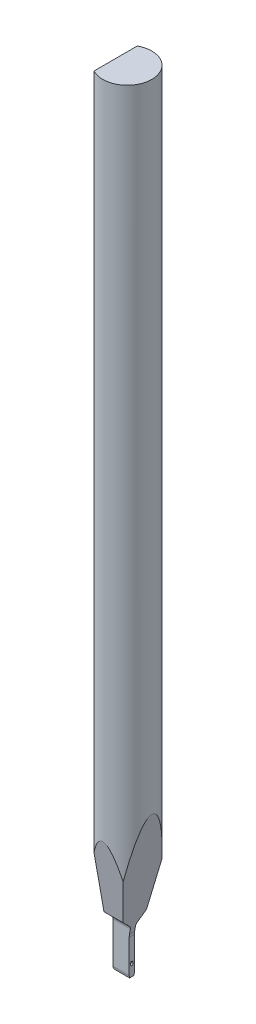
ISO-10303-21;
HEADER;
FILE_DESCRIPTION(('STEP AP214'),'2;1');
FILE_NAME('part.step','',(''),(''),'','','');
FILE_SCHEMA(('AUTOMOTIVE_DESIGN { 1 0 10303 214 1 1 1 1 }'));
ENDSEC;
DATA;
#1=APPLICATION_CONTEXT('core data for automotive mechanical design processes');
#2=APPLICATION_PROTOCOL_DEFINITION('international standard','automotive_design',2000,#1);
#3=PRODUCT_CONTEXT('',#1,'mechanical');
#4=PRODUCT('Part','Part','',(#3));
#5=PRODUCT_RELATED_PRODUCT_CATEGORY('part','',(#4));
#6=PRODUCT_DEFINITION_FORMATION('','',#4);
#7=PRODUCT_DEFINITION_CONTEXT('part definition',#1,'design');
#8=PRODUCT_DEFINITION('design','',#6,#7);
#9=PRODUCT_DEFINITION_SHAPE('','',#8);
#10=(LENGTH_UNIT() NAMED_UNIT(*) SI_UNIT(.MILLI.,.METRE.));
#11=(NAMED_UNIT(*) PLANE_ANGLE_UNIT() SI_UNIT($,.RADIAN.));
#12=(NAMED_UNIT(*) SI_UNIT($,.STERADIAN.) SOLID_ANGLE_UNIT());
#13=UNCERTAINTY_MEASURE_WITH_UNIT(LENGTH_MEASURE(1.E-05),#10,'distance_accuracy_value','');
#14=(GEOMETRIC_REPRESENTATION_CONTEXT(3) GLOBAL_UNCERTAINTY_ASSIGNED_CONTEXT((#13)) GLOBAL_UNIT_ASSIGNED_CONTEXT((#10,
#11,#12)) REPRESENTATION_CONTEXT('',''));
#15=CARTESIAN_POINT('',(0.,0.,0.));
#16=DIRECTION('',(0.,0.,1.));
#17=DIRECTION('',(1.,0.,0.));
#18=AXIS2_PLACEMENT_3D('',#15,#16,#17);
#19=CARTESIAN_POINT('',(32.026237028911,0.,0.06985));
#20=DIRECTION('',(0.,-0.173648177666931,0.984807753012208));
#21=DIRECTION('',(0.,-0.984807753012208,-0.173648177666931));
#22=AXIS2_PLACEMENT_3D('',#19,#20,#21);
#23=PLANE('',#22);
#24=CARTESIAN_POINT('',(-0.3480816,0.02794,0.0747765758409916));
#25=DIRECTION('',(0.,-0.173648177666931,0.984807753012208));
#26=DIRECTION('',(0.,-0.984807753012208,-0.173648177666931));
#27=AXIS2_PLACEMENT_3D('',#24,#25,#26);
#28=ELLIPSE('',#27,0.0283710195360877,0.02794);
#29=CARTESIAN_POINT('',(-0.3480816,0.,0.069849999999997));
#30=VERTEX_POINT('',#29);
#31=CARTESIAN_POINT('',(-0.37592,0.0255594358987768,0.0743568181606428));
#32=VERTEX_POINT('',#31);
#33=EDGE_CURVE('E68',#30,#32,#28,.F.);
#34=ORIENTED_EDGE('',*,*,#33,.F.);
#35=DIRECTION('',(-1.,0.,0.));
#36=VECTOR('',#35,1.);
#37=CARTESIAN_POINT('',(32.026237028911,0.,0.06985));
#38=LINE('',#37,#36);
#39=CARTESIAN_POINT('',(0.14478,0.,0.0698500000000075));
#40=VERTEX_POINT('',#39);
#41=EDGE_CURVE('E462',#40,#30,#38,.T.);
#42=ORIENTED_EDGE('',*,*,#41,.F.);
#43=DIRECTION('',(0.,0.984807753012208,0.173648177666931));
#44=VECTOR('',#43,1.);
#45=CARTESIAN_POINT('',(0.14478,5.58304591418895,1.05429162920568));
#46=LINE('',#45,#44);
#47=CARTESIAN_POINT('',(0.144779999999997,0.0720252791091445,0.08255));
#48=VERTEX_POINT('',#47);
#49=EDGE_CURVE('E298',#40,#48,#46,.T.);
#50=ORIENTED_EDGE('',*,*,#49,.T.);
#51=DIRECTION('',(-1.,0.,0.));
#52=VECTOR('',#51,1.);
#53=CARTESIAN_POINT('',(32.026237028911,0.0720252791091445,0.08255));
#54=LINE('',#53,#52);
#55=CARTESIAN_POINT('',(-0.375920000000002,0.0720252791091445,0.08255));
#56=VERTEX_POINT('',#55);
#57=EDGE_CURVE('E313',#48,#56,#54,.T.);
#58=ORIENTED_EDGE('',*,*,#57,.T.);
#59=DIRECTION('',(0.,0.984807753012208,0.173648177666931));
#60=VECTOR('',#59,1.);
#61=CARTESIAN_POINT('',(-0.37592,24.4849190715876,4.38720185278417));
#62=LINE('',#61,#60);
#63=EDGE_CURVE('E54',#32,#56,#62,.T.);
#64=ORIENTED_EDGE('',*,*,#63,.F.);
#65=EDGE_LOOP('',(#34,#42,#50,#58,#64));
#66=FACE_BOUND('',#65,.T.);
#67=ADVANCED_FACE('F46',(#66),#23,.T.);
#68=CARTESIAN_POINT('',(32.026237028911,0.,-0.06985));
#69=DIRECTION('',(0.,-0.173648177666931,-0.984807753012208));
#70=DIRECTION('',(0.,0.984807753012208,-0.173648177666931));
#71=AXIS2_PLACEMENT_3D('',#68,#69,#70);
#72=PLANE('',#71);
#73=CARTESIAN_POINT('',(-0.3480816,0.02794,-0.0747765758409916));
#74=DIRECTION('',(0.,-0.173648177666931,-0.984807753012208));
#75=DIRECTION('',(0.,0.984807753012208,-0.173648177666931));
#76=AXIS2_PLACEMENT_3D('',#73,#74,#75);
#77=ELLIPSE('',#76,0.0283710195360877,0.02794);
#78=CARTESIAN_POINT('',(-0.37592,0.0255594358987803,-0.0743568181606437));
#79=VERTEX_POINT('',#78);
#80=CARTESIAN_POINT('',(-0.3480816,0.,-0.069849999999997));
#81=VERTEX_POINT('',#80);
#82=EDGE_CURVE('E232',#79,#81,#77,.F.);
#83=ORIENTED_EDGE('',*,*,#82,.F.);
#84=DIRECTION('',(0.,-0.984807753012208,0.173648177666931));
#85=VECTOR('',#84,1.);
#86=CARTESIAN_POINT('',(-0.37592,24.7593833893632,-4.43559731724975));
#87=LINE('',#86,#85);
#88=CARTESIAN_POINT('',(-0.375920000000002,0.0720252791091445,-0.08255));
#89=VERTEX_POINT('',#88);
#90=EDGE_CURVE('E228',#89,#79,#87,.T.);
#91=ORIENTED_EDGE('',*,*,#90,.F.);
#92=DIRECTION('',(1.,0.,0.));
#93=VECTOR('',#92,1.);
#94=CARTESIAN_POINT('',(32.026237028911,0.0720252791091445,-0.08255));
#95=LINE('',#94,#93);
#96=CARTESIAN_POINT('',(0.14478,0.0720252791091454,-0.0825500000000046));
#97=VERTEX_POINT('',#96);
#98=EDGE_CURVE('E304',#89,#97,#95,.T.);
#99=ORIENTED_EDGE('',*,*,#98,.T.);
#100=DIRECTION('',(0.,-0.984807753012208,0.173648177666931));
#101=VECTOR('',#100,1.);
#102=CARTESIAN_POINT('',(0.14478,-5.60693602120025,0.918804099643775));
#103=LINE('',#102,#101);
#104=CARTESIAN_POINT('',(0.144779999999997,0.,-0.06985));
#105=VERTEX_POINT('',#104);
#106=EDGE_CURVE('E301',#97,#105,#103,.T.);
#107=ORIENTED_EDGE('',*,*,#106,.T.);
#108=DIRECTION('',(-1.,0.,0.));
#109=VECTOR('',#108,1.);
#110=CARTESIAN_POINT('',(32.026237028911,0.,-0.06985));
#111=LINE('',#110,#109);
#112=EDGE_CURVE('E464',#105,#81,#111,.T.);
#113=ORIENTED_EDGE('',*,*,#112,.T.);
#114=EDGE_LOOP('',(#83,#91,#99,#107,#113));
#115=FACE_BOUND('',#114,.T.);
#116=ADVANCED_FACE('F390',(#115),#72,.T.);
#117=CARTESIAN_POINT('',(0.,0.,0.));
#118=DIRECTION('',(0.,1.,0.));
#119=DIRECTION('',(0.,0.,1.));
#120=AXIS2_PLACEMENT_3D('',#117,#118,#119);
#121=PLANE('',#120);
#122=ORIENTED_EDGE('',*,*,#41,.T.);
#123=DIRECTION('',(0.,0.,-1.));
#124=VECTOR('',#123,1.);
#125=CARTESIAN_POINT('',(-0.3480816,0.,31.9120846403235));
#126=LINE('',#125,#124);
#127=CARTESIAN_POINT('',(-0.348081600000001,0.,0.0482432865795852));
#128=VERTEX_POINT('',#127);
#129=EDGE_CURVE('E539',#30,#128,#126,.T.);
#130=ORIENTED_EDGE('',*,*,#129,.T.);
#131=DIRECTION('',(-1.,0.,0.));
#132=VECTOR('',#131,1.);
#133=CARTESIAN_POINT('',(32.026237028911,0.,0.0482432865795852));
#134=LINE('',#133,#132);
#135=CARTESIAN_POINT('',(0.144779999999997,0.,0.0482432865795852));
#136=VERTEX_POINT('',#135);
#137=EDGE_CURVE('E331',#136,#128,#134,.T.);
#138=ORIENTED_EDGE('',*,*,#137,.F.);
#139=DIRECTION('',(0.,0.,-1.));
#140=VECTOR('',#139,1.);
#141=CARTESIAN_POINT('',(0.14478,0.,32.7173184204362));
#142=LINE('',#141,#140);
#143=EDGE_CURVE('E282',#40,#136,#142,.T.);
#144=ORIENTED_EDGE('',*,*,#143,.F.);
#145=EDGE_LOOP('',(#122,#130,#138,#144));
#146=FACE_BOUND('',#145,.T.);
#147=ADVANCED_FACE('F379',(#146),#121,.F.);
#148=DIRECTION('',(-1.,0.,0.));
#149=VECTOR('',#148,1.);
#150=CARTESIAN_POINT('',(32.026237028911,0.,-0.0482432865795852));
#151=LINE('',#150,#149);
#152=CARTESIAN_POINT('',(0.144779999999997,0.,-0.0482432865795852));
#153=VERTEX_POINT('',#152);
#154=CARTESIAN_POINT('',(-0.348081600000001,0.,-0.0482432865795852));
#155=VERTEX_POINT('',#154);
#156=EDGE_CURVE('E481',#153,#155,#151,.T.);
#157=ORIENTED_EDGE('',*,*,#156,.T.);
#158=EDGE_CURVE('E469',#155,#81,#126,.T.);
#159=ORIENTED_EDGE('',*,*,#158,.T.);
#160=ORIENTED_EDGE('',*,*,#112,.F.);
#161=EDGE_CURVE('E286',#153,#105,#142,.T.);
#162=ORIENTED_EDGE('',*,*,#161,.F.);
#163=EDGE_LOOP('',(#157,#159,#160,#162));
#164=FACE_BOUND('',#163,.T.);
#165=ADVANCED_FACE('F369',(#164),#121,.F.);
#166=CARTESIAN_POINT('',(-0.37592,25.4,-0.80247998));
#167=DIRECTION('',(-1.,0.,0.));
#168=DIRECTION('',(0.,0.,1.));
#169=AXIS2_PLACEMENT_3D('',#166,#167,#168);
#170=PLANE('',#169);
#171=CARTESIAN_POINT('',(-0.37592,0.,0.0482432865795852));
#172=CARTESIAN_POINT('',(-0.37592,0.0149574693246277,0.0344039161936227));
#173=CARTESIAN_POINT('',(-0.37592,0.0292099999999983,0.0174815349681417));
#174=CARTESIAN_POINT('',(-0.37592,0.0292099999999983,-0.0174815349681413));
#175=CARTESIAN_POINT('',(-0.37592,0.0149574693246281,-0.0344039161936234));
#176=CARTESIAN_POINT('',(-0.37592,0.,-0.0482432865795854));
#177=(BOUNDED_CURVE() B_SPLINE_CURVE(3,(#171,#172,#173,#174,#175,#176),.UNSPECIFIED.,.F.,
.F.) B_SPLINE_CURVE_WITH_KNOTS((4,2,4),(1.41317404265068,1.5707963267949,1.72841861093912),
.UNSPECIFIED.) CURVE() GEOMETRIC_REPRESENTATION_ITEM() RATIONAL_B_SPLINE_CURVE((1.,1.,1.,1.,1.,1.)) REPRESENTATION_ITEM(''));
#178=CARTESIAN_POINT('',(-0.375920000000074,0.0255595595870615,-0.0157980499526133));
#179=VERTEX_POINT('',#178);
#180=CARTESIAN_POINT('',(-0.375920000000002,0.0255594691975298,0.0159098927846868));
#181=VERTEX_POINT('',#180);
#182=EDGE_CURVE('E214',#179,#181,#177,.F.);
#183=ORIENTED_EDGE('',*,*,#182,.T.);
#184=DIRECTION('',(0.,0.,-1.));
#185=VECTOR('',#184,1.);
#186=CARTESIAN_POINT('',(-0.37592,0.0255594358987817,31.9120846403235));
#187=LINE('',#186,#185);
#188=EDGE_CURVE('E76',#32,#181,#187,.T.);
#189=ORIENTED_EDGE('',*,*,#188,.F.);
#190=ORIENTED_EDGE('',*,*,#63,.T.);
#191=DIRECTION('',(0.,1.,0.));
#192=VECTOR('',#191,1.);
#193=CARTESIAN_POINT('',(-0.37592,25.4,0.08255));
#194=LINE('',#193,#192);
#195=CARTESIAN_POINT('',(-0.375920000000002,1.397,0.08255));
#196=VERTEX_POINT('',#195);
#197=EDGE_CURVE('E451',#56,#196,#194,.T.);
#198=ORIENTED_EDGE('',*,*,#197,.T.);
#199=CARTESIAN_POINT('',(-0.375920000000002,1.397,0.20955));
#200=DIRECTION('',(-1.,0.,0.));
#201=DIRECTION('',(0.,0.,1.));
#202=AXIS2_PLACEMENT_3D('',#199,#200,#201);
#203=CIRCLE('',#202,0.127);
#204=CARTESIAN_POINT('',(-0.375920000000002,1.48680256121069,0.119747438789309));
#205=VERTEX_POINT('',#204);
#206=EDGE_CURVE('E456',#196,#205,#203,.F.);
#207=ORIENTED_EDGE('',*,*,#206,.T.);
#208=DIRECTION('',(0.,0.707106781186546,0.707106781186549));
#209=VECTOR('',#208,1.);
#210=CARTESIAN_POINT('',(-0.37592,12.9822875712106,11.6152324487893));
#211=LINE('',#210,#209);
#212=CARTESIAN_POINT('',(-0.375920000000002,1.74450915444251,0.377454032021126));
#213=VERTEX_POINT('',#212);
#214=EDGE_CURVE('E445',#205,#213,#211,.T.);
#215=ORIENTED_EDGE('',*,*,#214,.T.);
#216=CARTESIAN_POINT('',(-0.37592,3.56040301205043,0.69764511322018));
#217=VERTEX_POINT('',#216);
#218=EDGE_CURVE('E407',#213,#217,#62,.T.);
#219=ORIENTED_EDGE('',*,*,#218,.T.);
#220=DIRECTION('',(0.,-1.,0.));
#221=VECTOR('',#220,1.);
#222=CARTESIAN_POINT('',(-0.37592,25.4,0.69764511322018));
#223=LINE('',#222,#221);
#224=CARTESIAN_POINT('',(-0.37592,25.4,0.69764511322018));
#225=VERTEX_POINT('',#224);
#226=EDGE_CURVE('E288',#217,#225,#223,.F.);
#227=ORIENTED_EDGE('',*,*,#226,.T.);
#228=DIRECTION('',(0.,0.,-1.));
#229=VECTOR('',#228,1.);
#230=CARTESIAN_POINT('',(-0.37592,25.4,-0.80247998));
#231=LINE('',#230,#229);
#232=CARTESIAN_POINT('',(-0.37592,25.4,-0.69764511322018));
#233=VERTEX_POINT('',#232);
#234=EDGE_CURVE('E281',#225,#233,#231,.T.);
#235=ORIENTED_EDGE('',*,*,#234,.T.);
#236=DIRECTION('',(0.,-1.,0.));
#237=VECTOR('',#236,1.);
#238=CARTESIAN_POINT('',(-0.37592,25.4,-0.69764511322018));
#239=LINE('',#238,#237);
#240=CARTESIAN_POINT('',(-0.37592,3.56040301205043,-0.697645113220179));
#241=VERTEX_POINT('',#240);
#242=EDGE_CURVE('E290',#233,#241,#239,.T.);
#243=ORIENTED_EDGE('',*,*,#242,.T.);
#244=CARTESIAN_POINT('',(-0.375920000000002,1.74450915444251,-0.377454032021126));
#245=VERTEX_POINT('',#244);
#246=EDGE_CURVE('E268',#241,#245,#87,.T.);
#247=ORIENTED_EDGE('',*,*,#246,.T.);
#248=DIRECTION('',(0.,-0.707106781186546,0.707106781186549));
#249=VECTOR('',#248,1.);
#250=CARTESIAN_POINT('',(-0.37592,13.7847675512106,-12.4177124287893));
#251=LINE('',#250,#249);
#252=CARTESIAN_POINT('',(-0.375920000000002,1.48680256121069,-0.119747438789309));
#253=VERTEX_POINT('',#252);
#254=EDGE_CURVE('E435',#245,#253,#251,.T.);
#255=ORIENTED_EDGE('',*,*,#254,.T.);
#256=CARTESIAN_POINT('',(-0.375920000000002,1.397,-0.20955));
#257=DIRECTION('',(-1.,0.,0.));
#258=DIRECTION('',(0.,0.,1.));
#259=AXIS2_PLACEMENT_3D('',#256,#257,#258);
#260=CIRCLE('',#259,0.127);
#261=CARTESIAN_POINT('',(-0.375920000000002,1.397,-0.0825500000000001));
#262=VERTEX_POINT('',#261);
#263=EDGE_CURVE('E459',#253,#262,#260,.F.);
#264=ORIENTED_EDGE('',*,*,#263,.T.);
#265=DIRECTION('',(0.,-1.,0.));
#266=VECTOR('',#265,1.);
#267=CARTESIAN_POINT('',(-0.37592,25.4,-0.08255));
#268=LINE('',#267,#266);
#269=EDGE_CURVE('E440',#262,#89,#268,.T.);
#270=ORIENTED_EDGE('',*,*,#269,.T.);
#271=ORIENTED_EDGE('',*,*,#90,.T.);
#272=EDGE_CURVE('E224',#179,#79,#187,.T.);
#273=ORIENTED_EDGE('',*,*,#272,.F.);
#274=EDGE_LOOP('',(#183,#189,#190,#198,#207,#215,#219,#227,#235,#243,#247,#255,#264,#270,#271,#273));
#275=FACE_BOUND('',#274,.T.);
#276=ADVANCED_FACE('F225',(#275),#170,.T.);
#277=CARTESIAN_POINT('',(0.65278,1.143,32.7173184204362));
#278=DIRECTION('',(0.,0.,-1.));
#279=DIRECTION('',(-1.,0.,0.));
#280=AXIS2_PLACEMENT_3D('',#277,#278,#279);
#281=CYLINDRICAL_SURFACE('',#280,0.508);
#282=CARTESIAN_POINT('',(0.65278,1.143,-0.0825500000000007));
#283=DIRECTION('',(0.,0.,-1.));
#284=DIRECTION('',(-1.,0.,0.));
#285=AXIS2_PLACEMENT_3D('',#282,#283,#284);
#286=CIRCLE('',#285,0.508);
#287=CARTESIAN_POINT('',(0.152497661469798,1.2312132742548,-0.0825500000000007));
#288=VERTEX_POINT('',#287);
#289=CARTESIAN_POINT('',(0.14478,1.143,-0.0825500000000007));
#290=VERTEX_POINT('',#289);
#291=EDGE_CURVE('E524',#288,#290,#286,.F.);
#292=ORIENTED_EDGE('',*,*,#291,.F.);
#293=DIRECTION('',(0.,0.,-1.));
#294=VECTOR('',#293,1.);
#295=CARTESIAN_POINT('',(0.152497661469798,1.2312132742548,32.7173184204362));
#296=LINE('',#295,#294);
#297=CARTESIAN_POINT('',(0.152497661469798,1.2312132742548,0.0825500000000007));
#298=VERTEX_POINT('',#297);
#299=EDGE_CURVE('E274',#298,#288,#296,.T.);
#300=ORIENTED_EDGE('',*,*,#299,.F.);
#301=CARTESIAN_POINT('',(0.65278,1.143,0.0825500000000007));
#302=DIRECTION('',(0.,0.,1.));
#303=DIRECTION('',(1.,0.,0.));
#304=AXIS2_PLACEMENT_3D('',#301,#302,#303);
#305=CIRCLE('',#304,0.508);
#306=CARTESIAN_POINT('',(0.14478,1.143,0.0825500000000007));
#307=VERTEX_POINT('',#306);
#308=EDGE_CURVE('E449',#307,#298,#305,.F.);
#309=ORIENTED_EDGE('',*,*,#308,.F.);
#310=DIRECTION('',(0.,0.,-1.));
#311=VECTOR('',#310,1.);
#312=CARTESIAN_POINT('',(0.14478,1.143,32.7173184204362));
#313=LINE('',#312,#311);
#314=EDGE_CURVE('E278',#307,#290,#313,.T.);
#315=ORIENTED_EDGE('',*,*,#314,.T.);
#316=EDGE_LOOP('',(#292,#300,#309,#315));
#317=FACE_BOUND('',#316,.T.);
#318=ADVANCED_FACE('F368',(#317),#281,.F.);
#319=CARTESIAN_POINT('',(0.152497661469798,1.2312132742548,32.7173184204362));
#320=DIRECTION('',(-0.984807753012208,0.173648177666931,0.));
#321=DIRECTION('',(-0.173648177666931,-0.984807753012208,0.));
#322=AXIS2_PLACEMENT_3D('',#319,#320,#321);
#323=PLANE('',#322);
#324=DIRECTION('',(-0.123724030206484,-0.701673843159862,0.701673843159865));
#325=VECTOR('',#324,1.);
#326=CARTESIAN_POINT('',(-2.67602790121398,-14.8101523257176,16.1772074481391));
#327=LINE('',#326,#325);
#328=CARTESIAN_POINT('',(0.243005574233389,1.74450915444251,-0.377454032021128));
#329=VERTEX_POINT('',#328);
#330=CARTESIAN_POINT('',(0.197564948740153,1.48680256121069,-0.119747438789309));
#331=VERTEX_POINT('',#330);
#332=EDGE_CURVE('E430',#329,#331,#327,.T.);
#333=ORIENTED_EDGE('',*,*,#332,.F.);
#334=DIRECTION('',(-0.171087869746036,-0.970287525247814,0.171087869746036));
#335=VECTOR('',#334,1.);
#336=CARTESIAN_POINT('',(-0.813572118873737,-4.24764070748955,0.679123661086002));
#337=LINE('',#336,#335);
#338=CARTESIAN_POINT('',(0.489096881841309,3.14016231324524,-0.623545339629049));
#339=VERTEX_POINT('',#338);
#340=EDGE_CURVE('E413',#339,#329,#337,.T.);
#341=ORIENTED_EDGE('',*,*,#340,.F.);
#342=CARTESIAN_POINT('',(0.,0.366356059226924,0.));
#343=DIRECTION('',(-0.984807753012208,0.173648177666931,0.));
#344=DIRECTION('',(-0.173648177666931,-0.984807753012208,0.));
#345=AXIS2_PLACEMENT_3D('',#342,#343,#344);
#346=ELLIPSE('',#345,4.56371043248165,0.792479999999998);
#347=CARTESIAN_POINT('',(0.489096881841307,3.14016231324523,0.623545339629051));
#348=VERTEX_POINT('',#347);
#349=EDGE_CURVE('E285',#348,#339,#346,.T.);
#350=ORIENTED_EDGE('',*,*,#349,.F.);
#351=DIRECTION('',(0.171087869746036,0.970287525247814,0.171087869746036));
#352=VECTOR('',#351,1.);
#353=CARTESIAN_POINT('',(1.10176900814012,6.61479860451023,1.23621746592787));
#354=LINE('',#353,#352);
#355=CARTESIAN_POINT('',(0.243005574233389,1.74450915444251,0.37745403202113));
#356=VERTEX_POINT('',#355);
#357=EDGE_CURVE('E414',#356,#348,#354,.T.);
#358=ORIENTED_EDGE('',*,*,#357,.F.);
#359=DIRECTION('',(0.123724030206484,0.701673843159862,0.701673843159865));
#360=VECTOR('',#359,1.);
#361=CARTESIAN_POINT('',(3.0046091496821,17.406341304876,16.0392861824547));
#362=LINE('',#361,#360);
#363=CARTESIAN_POINT('',(0.19756494874016,1.48680256121069,0.119747438789306));
#364=VERTEX_POINT('',#363);
#365=EDGE_CURVE('E438',#364,#356,#362,.T.);
#366=ORIENTED_EDGE('',*,*,#365,.F.);
#367=CARTESIAN_POINT('',(0.181730334261984,1.397,0.20955));
#368=DIRECTION('',(-0.984807753012208,0.173648177666931,0.));
#369=DIRECTION('',(-0.173648177666931,-0.984807753012208,0.));
#370=AXIS2_PLACEMENT_3D('',#367,#368,#369);
#371=ELLIPSE('',#370,0.12895917970949,0.127);
#372=CARTESIAN_POINT('',(0.181730334261984,1.397,0.08255));
#373=VERTEX_POINT('',#372);
#374=EDGE_CURVE('E316',#373,#364,#371,.F.);
#375=ORIENTED_EDGE('',*,*,#374,.F.);
#376=DIRECTION('',(0.173648177666931,0.984807753012208,0.));
#377=VECTOR('',#376,1.);
#378=CARTESIAN_POINT('',(0.152497661469798,1.2312132742548,0.0825500000000007));
#379=LINE('',#378,#377);
#380=EDGE_CURVE('E454',#298,#373,#379,.T.);
#381=ORIENTED_EDGE('',*,*,#380,.F.);
#382=ORIENTED_EDGE('',*,*,#299,.T.);
#383=DIRECTION('',(-0.173648177666931,-0.984807753012208,0.));
#384=VECTOR('',#383,1.);
#385=CARTESIAN_POINT('',(0.152497661469798,1.2312132742548,-0.0825500000000007));
#386=LINE('',#385,#384);
#387=CARTESIAN_POINT('',(0.181730334261995,1.397,-0.0825500000000004));
#388=VERTEX_POINT('',#387);
#389=EDGE_CURVE('E436',#388,#288,#386,.T.);
#390=ORIENTED_EDGE('',*,*,#389,.F.);
#391=CARTESIAN_POINT('',(0.181730334261984,1.397,-0.20955));
#392=DIRECTION('',(-0.984807753012208,0.173648177666931,0.));
#393=DIRECTION('',(-0.173648177666931,-0.984807753012208,0.));
#394=AXIS2_PLACEMENT_3D('',#391,#392,#393);
#395=ELLIPSE('',#394,0.12895917970949,0.127);
#396=EDGE_CURVE('E318',#331,#388,#395,.F.);
#397=ORIENTED_EDGE('',*,*,#396,.F.);
#398=EDGE_LOOP('',(#333,#341,#350,#358,#366,#375,#381,#382,#390,#397));
#399=FACE_BOUND('',#398,.T.);
#400=ADVANCED_FACE('F403',(#399),#323,.F.);
#401=CARTESIAN_POINT('',(0.14478,0.,32.7173184204362));
#402=DIRECTION('',(-1.,0.,0.));
#403=DIRECTION('',(0.,0.,1.));
#404=AXIS2_PLACEMENT_3D('',#401,#402,#403);
#405=PLANE('',#404);
#406=CARTESIAN_POINT('',(0.14478,0.370839999999998,0.));
#407=DIRECTION('',(-1.,0.,0.));
#408=DIRECTION('',(0.,1.,0.));
#409=AXIS2_PLACEMENT_3D('',#406,#407,#408);
#410=ELLIPSE('',#409,0.0628617928474839,0.0444500000000001);
#411=CARTESIAN_POINT('',(0.14478,0.433701792847482,0.));
#412=VERTEX_POINT('',#411);
#413=EDGE_CURVE('E321',#412,#412,#410,.T.);
#414=ORIENTED_EDGE('',*,*,#413,.T.);
#415=EDGE_LOOP('',(#414));
#416=FACE_BOUND('',#415,.T.);
#417=ORIENTED_EDGE('',*,*,#143,.T.);
#418=CARTESIAN_POINT('',(0.144779999999997,-0.30353,0.));
#419=DIRECTION('',(-1.,0.,0.));
#420=DIRECTION('',(0.,0.,1.));
#421=AXIS2_PLACEMENT_3D('',#418,#419,#420);
#422=CIRCLE('',#421,0.30734);
#423=EDGE_CURVE('E485',#136,#153,#422,.T.);
#424=ORIENTED_EDGE('',*,*,#423,.T.);
#425=ORIENTED_EDGE('',*,*,#161,.T.);
#426=ORIENTED_EDGE('',*,*,#106,.F.);
#427=DIRECTION('',(0.,-1.,0.));
#428=VECTOR('',#427,1.);
#429=CARTESIAN_POINT('',(0.14478,0.,-0.0825500000000007));
#430=LINE('',#429,#428);
#431=EDGE_CURVE('E522',#290,#97,#430,.T.);
#432=ORIENTED_EDGE('',*,*,#431,.F.);
#433=ORIENTED_EDGE('',*,*,#314,.F.);
#434=DIRECTION('',(0.,1.,0.));
#435=VECTOR('',#434,1.);
#436=CARTESIAN_POINT('',(0.14478,0.,0.0825500000000007));
#437=LINE('',#436,#435);
#438=EDGE_CURVE('E447',#48,#307,#437,.T.);
#439=ORIENTED_EDGE('',*,*,#438,.F.);
#440=ORIENTED_EDGE('',*,*,#49,.F.);
#441=EDGE_LOOP('',(#417,#424,#425,#426,#432,#433,#439,#440));
#442=FACE_BOUND('',#441,.T.);
#443=ADVANCED_FACE('F370',(#416,#442),#405,.F.);
#444=ORIENTED_EDGE('',*,*,#218,.F.);
#445=DIRECTION('',(1.,0.,0.));
#446=VECTOR('',#445,1.);
#447=CARTESIAN_POINT('',(32.026237028911,1.74450915444251,0.377454032021126));
#448=LINE('',#447,#446);
#449=EDGE_CURVE('E310',#213,#356,#448,.T.);
#450=ORIENTED_EDGE('',*,*,#449,.T.);
#451=ORIENTED_EDGE('',*,*,#357,.T.);
#452=CARTESIAN_POINT('',(0.,-0.396139035100294,0.));
#453=DIRECTION('',(0.,-0.173648177666931,0.984807753012208));
#454=DIRECTION('',(0.,-0.984807753012208,-0.173648177666931));
#455=AXIS2_PLACEMENT_3D('',#452,#453,#454);
#456=ELLIPSE('',#455,4.56371043248163,0.792479999999998);
#457=EDGE_CURVE('E410',#348,#217,#456,.T.);
#458=ORIENTED_EDGE('',*,*,#457,.T.);
#459=EDGE_LOOP('',(#444,#450,#451,#458));
#460=FACE_BOUND('',#459,.T.);
#461=ADVANCED_FACE('F387',(#460),#23,.T.);
#462=ORIENTED_EDGE('',*,*,#340,.T.);
#463=DIRECTION('',(-1.,0.,0.));
#464=VECTOR('',#463,1.);
#465=CARTESIAN_POINT('',(32.026237028911,1.74450915444251,-0.377454032021126));
#466=LINE('',#465,#464);
#467=EDGE_CURVE('E307',#329,#245,#466,.T.);
#468=ORIENTED_EDGE('',*,*,#467,.T.);
#469=ORIENTED_EDGE('',*,*,#246,.F.);
#470=CARTESIAN_POINT('',(0.,-0.396139035100294,0.));
#471=DIRECTION('',(0.,-0.173648177666931,-0.984807753012208));
#472=DIRECTION('',(0.,-0.984807753012208,0.173648177666931));
#473=AXIS2_PLACEMENT_3D('',#470,#471,#472);
#474=ELLIPSE('',#473,4.56371043248163,0.792479999999998);
#475=EDGE_CURVE('E269',#241,#339,#474,.T.);
#476=ORIENTED_EDGE('',*,*,#475,.T.);
#477=EDGE_LOOP('',(#462,#468,#469,#476));
#478=FACE_BOUND('',#477,.T.);
#479=ADVANCED_FACE('F382',(#478),#72,.T.);
#480=CARTESIAN_POINT('',(0.,25.4,0.));
#481=DIRECTION('',(0.,-1.,0.));
#482=DIRECTION('',(0.,0.,-1.));
#483=AXIS2_PLACEMENT_3D('',#480,#481,#482);
#484=CYLINDRICAL_SURFACE('',#483,0.792479999999998);
#485=ORIENTED_EDGE('',*,*,#475,.F.);
#486=ORIENTED_EDGE('',*,*,#242,.F.);
#487=CARTESIAN_POINT('',(0.,25.4,0.));
#488=DIRECTION('',(0.,1.,0.));
#489=DIRECTION('',(0.,0.,1.));
#490=AXIS2_PLACEMENT_3D('',#487,#488,#489);
#491=CIRCLE('',#490,0.792479999999998);
#492=EDGE_CURVE('E293',#225,#233,#491,.T.);
#493=ORIENTED_EDGE('',*,*,#492,.F.);
#494=ORIENTED_EDGE('',*,*,#226,.F.);
#495=ORIENTED_EDGE('',*,*,#457,.F.);
#496=ORIENTED_EDGE('',*,*,#349,.T.);
#497=EDGE_LOOP('',(#485,#486,#493,#494,#495,#496));
#498=FACE_BOUND('',#497,.T.);
#499=ADVANCED_FACE('F376',(#498),#484,.T.);
#500=CARTESIAN_POINT('',(0.,25.4,0.));
#501=DIRECTION('',(0.,1.,0.));
#502=DIRECTION('',(0.,0.,1.));
#503=AXIS2_PLACEMENT_3D('',#500,#501,#502);
#504=PLANE('',#503);
#505=ORIENTED_EDGE('',*,*,#492,.T.);
#506=ORIENTED_EDGE('',*,*,#234,.F.);
#507=EDGE_LOOP('',(#505,#506));
#508=FACE_BOUND('',#507,.T.);
#509=ADVANCED_FACE('F372',(#508),#504,.T.);
#510=CARTESIAN_POINT('',(32.026237028911,0.,-0.08255));
#511=DIRECTION('',(0.,0.,-1.));
#512=DIRECTION('',(-1.,0.,0.));
#513=AXIS2_PLACEMENT_3D('',#510,#511,#512);
#514=PLANE('',#513);
#515=DIRECTION('',(-1.,0.,0.));
#516=VECTOR('',#515,1.);
#517=CARTESIAN_POINT('',(32.026237028911,1.397,-0.0825500000000001));
#518=LINE('',#517,#516);
#519=EDGE_CURVE('E517',#388,#262,#518,.T.);
#520=ORIENTED_EDGE('',*,*,#519,.F.);
#521=ORIENTED_EDGE('',*,*,#389,.T.);
#522=ORIENTED_EDGE('',*,*,#291,.T.);
#523=ORIENTED_EDGE('',*,*,#431,.T.);
#524=ORIENTED_EDGE('',*,*,#98,.F.);
#525=ORIENTED_EDGE('',*,*,#269,.F.);
#526=EDGE_LOOP('',(#520,#521,#522,#523,#524,#525));
#527=FACE_BOUND('',#526,.T.);
#528=ADVANCED_FACE('F375',(#527),#514,.T.);
#529=CARTESIAN_POINT('',(32.026237028911,1.48680256121069,-0.119747438789309));
#530=DIRECTION('',(0.,-0.707106781186549,-0.707106781186546));
#531=DIRECTION('',(0.,0.707106781186546,-0.707106781186549));
#532=AXIS2_PLACEMENT_3D('',#529,#530,#531);
#533=PLANE('',#532);
#534=ORIENTED_EDGE('',*,*,#254,.F.);
#535=ORIENTED_EDGE('',*,*,#467,.F.);
#536=ORIENTED_EDGE('',*,*,#332,.T.);
#537=DIRECTION('',(-1.,0.,0.));
#538=VECTOR('',#537,1.);
#539=CARTESIAN_POINT('',(32.026237028911,1.48680256121069,-0.119747438789309));
#540=LINE('',#539,#538);
#541=EDGE_CURVE('E520',#331,#253,#540,.T.);
#542=ORIENTED_EDGE('',*,*,#541,.T.);
#543=EDGE_LOOP('',(#534,#535,#536,#542));
#544=FACE_BOUND('',#543,.T.);
#545=ADVANCED_FACE('F575',(#544),#533,.T.);
#546=CARTESIAN_POINT('',(32.026237028911,1.397,-0.20955));
#547=DIRECTION('',(-1.,0.,0.));
#548=DIRECTION('',(0.,0.,1.));
#549=AXIS2_PLACEMENT_3D('',#546,#547,#548);
#550=CYLINDRICAL_SURFACE('',#549,0.127);
#551=ORIENTED_EDGE('',*,*,#263,.F.);
#552=ORIENTED_EDGE('',*,*,#541,.F.);
#553=ORIENTED_EDGE('',*,*,#396,.T.);
#554=ORIENTED_EDGE('',*,*,#519,.T.);
#555=EDGE_LOOP('',(#551,#552,#553,#554));
#556=FACE_BOUND('',#555,.T.);
#557=ADVANCED_FACE('F571',(#556),#550,.F.);
#558=CARTESIAN_POINT('',(32.026237028911,1.397,0.20955));
#559=DIRECTION('',(-1.,0.,0.));
#560=DIRECTION('',(0.,0.,1.));
#561=AXIS2_PLACEMENT_3D('',#558,#559,#560);
#562=CYLINDRICAL_SURFACE('',#561,0.127);
#563=ORIENTED_EDGE('',*,*,#206,.F.);
#564=DIRECTION('',(-1.,0.,0.));
#565=VECTOR('',#564,1.);
#566=CARTESIAN_POINT('',(32.026237028911,1.397,0.08255));
#567=LINE('',#566,#565);
#568=EDGE_CURVE('E514',#373,#196,#567,.T.);
#569=ORIENTED_EDGE('',*,*,#568,.F.);
#570=ORIENTED_EDGE('',*,*,#374,.T.);
#571=DIRECTION('',(-1.,0.,0.));
#572=VECTOR('',#571,1.);
#573=CARTESIAN_POINT('',(32.026237028911,1.48680256121069,0.119747438789309));
#574=LINE('',#573,#572);
#575=EDGE_CURVE('E324',#364,#205,#574,.T.);
#576=ORIENTED_EDGE('',*,*,#575,.T.);
#577=EDGE_LOOP('',(#563,#569,#570,#576));
#578=FACE_BOUND('',#577,.T.);
#579=ADVANCED_FACE('F553',(#578),#562,.F.);
#580=CARTESIAN_POINT('',(32.026237028911,0.,0.08255));
#581=DIRECTION('',(0.,0.,1.));
#582=DIRECTION('',(1.,0.,0.));
#583=AXIS2_PLACEMENT_3D('',#580,#581,#582);
#584=PLANE('',#583);
#585=ORIENTED_EDGE('',*,*,#308,.T.);
#586=ORIENTED_EDGE('',*,*,#380,.T.);
#587=ORIENTED_EDGE('',*,*,#568,.T.);
#588=ORIENTED_EDGE('',*,*,#197,.F.);
#589=ORIENTED_EDGE('',*,*,#57,.F.);
#590=ORIENTED_EDGE('',*,*,#438,.T.);
#591=EDGE_LOOP('',(#585,#586,#587,#588,#589,#590));
#592=FACE_BOUND('',#591,.T.);
#593=ADVANCED_FACE('F544',(#592),#584,.T.);
#594=CARTESIAN_POINT('',(32.026237028911,1.48680256121069,0.119747438789309));
#595=DIRECTION('',(0.,-0.707106781186549,0.707106781186546));
#596=DIRECTION('',(0.,-0.707106781186546,-0.707106781186549));
#597=AXIS2_PLACEMENT_3D('',#594,#595,#596);
#598=PLANE('',#597);
#599=ORIENTED_EDGE('',*,*,#214,.F.);
#600=ORIENTED_EDGE('',*,*,#575,.F.);
#601=ORIENTED_EDGE('',*,*,#365,.T.);
#602=ORIENTED_EDGE('',*,*,#449,.F.);
#603=EDGE_LOOP('',(#599,#600,#601,#602));
#604=FACE_BOUND('',#603,.T.);
#605=ADVANCED_FACE('F556',(#604),#598,.T.);
#606=CARTESIAN_POINT('',(-0.333371792847487,-0.107311792847484,0.));
#607=DIRECTION('',(0.707106781186551,0.707106781186544,0.));
#608=DIRECTION('',(-0.707106781186544,0.707106781186551,0.));
#609=AXIS2_PLACEMENT_3D('',#606,#607,#608);
#610=CYLINDRICAL_SURFACE('',#609,0.0444500000000001);
#611=CARTESIAN_POINT('',(-0.0838200000000001,0.14224,0.));
#612=DIRECTION('',(1.,0.,0.));
#613=DIRECTION('',(0.,1.,0.));
#614=AXIS2_PLACEMENT_3D('',#611,#612,#613);
#615=ELLIPSE('',#614,0.0628617928474839,0.0444500000000001);
#616=CARTESIAN_POINT('',(-0.0838200000000001,0.14224,-0.0444500000000014));
#617=VERTEX_POINT('',#616);
#618=CARTESIAN_POINT('',(-0.0838200000000001,0.14224,0.04445));
#619=VERTEX_POINT('',#618);
#620=EDGE_CURVE('E491',#617,#619,#615,.F.);
#621=ORIENTED_EDGE('',*,*,#620,.T.);
#622=CARTESIAN_POINT('',(-0.0838200000000001,0.14224,0.));
#623=DIRECTION('',(0.,1.,0.));
#624=DIRECTION('',(1.,0.,0.));
#625=AXIS2_PLACEMENT_3D('',#622,#623,#624);
#626=ELLIPSE('',#625,0.0628617928474846,0.0444500000000001);
#627=EDGE_CURVE('E488',#619,#617,#626,.F.);
#628=ORIENTED_EDGE('',*,*,#627,.T.);
#629=EDGE_LOOP('',(#621,#628));
#630=FACE_BOUND('',#629,.T.);
#631=ORIENTED_EDGE('',*,*,#413,.F.);
#632=EDGE_LOOP('',(#631));
#633=FACE_BOUND('',#632,.T.);
#634=ADVANCED_FACE('F558',(#630,#633),#610,.F.);
#635=CARTESIAN_POINT('',(-0.204897697710467,0.14224,0.04445));
#636=DIRECTION('',(0.,-1.,0.));
#637=DIRECTION('',(0.,0.,-1.));
#638=AXIS2_PLACEMENT_3D('',#635,#636,#637);
#639=PLANE('',#638);
#640=DIRECTION('',(-1.,0.,0.));
#641=VECTOR('',#640,1.);
#642=CARTESIAN_POINT('',(-0.204897697710467,0.14224,0.04445));
#643=LINE('',#642,#641);
#644=CARTESIAN_POINT('',(-0.204897697710467,0.14224,0.04445));
#645=VERTEX_POINT('',#644);
#646=EDGE_CURVE('E495',#619,#645,#643,.T.);
#647=ORIENTED_EDGE('',*,*,#646,.T.);
#648=DIRECTION('',(0.,0.,-1.));
#649=VECTOR('',#648,1.);
#650=CARTESIAN_POINT('',(-0.204897697710467,0.14224,0.04445));
#651=LINE('',#650,#649);
#652=CARTESIAN_POINT('',(-0.204897697710467,0.14224,-0.04445));
#653=VERTEX_POINT('',#652);
#654=EDGE_CURVE('E325',#645,#653,#651,.T.);
#655=ORIENTED_EDGE('',*,*,#654,.T.);
#656=DIRECTION('',(-1.,0.,0.));
#657=VECTOR('',#656,1.);
#658=CARTESIAN_POINT('',(-0.204897697710467,0.14224,-0.04445));
#659=LINE('',#658,#657);
#660=EDGE_CURVE('E494',#617,#653,#659,.T.);
#661=ORIENTED_EDGE('',*,*,#660,.F.);
#662=ORIENTED_EDGE('',*,*,#627,.F.);
#663=EDGE_LOOP('',(#647,#655,#661,#662));
#664=FACE_BOUND('',#663,.T.);
#665=ADVANCED_FACE('F564',(#664),#639,.T.);
#666=CARTESIAN_POINT('',(-0.28702,0.,0.04445));
#667=DIRECTION('',(0.866025403784437,-0.500000000000004,0.));
#668=DIRECTION('',(0.500000000000004,0.866025403784436,0.));
#669=AXIS2_PLACEMENT_3D('',#666,#667,#668);
#670=PLANE('',#669);
#671=CARTESIAN_POINT('',(-0.462263127207131,-0.30353,0.));
#672=DIRECTION('',(0.866025403784437,-0.500000000000004,0.));
#673=DIRECTION('',(-0.500000000000004,-0.866025403784436,0.));
#674=AXIS2_PLACEMENT_3D('',#671,#672,#673);
#675=ELLIPSE('',#674,0.35488566346548,0.30734);
#676=CARTESIAN_POINT('',(-0.286685914277885,0.000578653444785084,-0.04445));
#677=VERTEX_POINT('',#676);
#678=CARTESIAN_POINT('',(-0.286685914277887,0.000578653444783337,0.04445));
#679=VERTEX_POINT('',#678);
#680=EDGE_CURVE('E480',#677,#679,#675,.T.);
#681=ORIENTED_EDGE('',*,*,#680,.F.);
#682=DIRECTION('',(-0.500000000000004,-0.866025403784436,0.));
#683=VECTOR('',#682,1.);
#684=CARTESIAN_POINT('',(-0.28702,0.,-0.04445));
#685=LINE('',#684,#683);
#686=EDGE_CURVE('E506',#653,#677,#685,.T.);
#687=ORIENTED_EDGE('',*,*,#686,.F.);
#688=ORIENTED_EDGE('',*,*,#654,.F.);
#689=DIRECTION('',(-0.500000000000004,-0.866025403784436,0.));
#690=VECTOR('',#689,1.);
#691=CARTESIAN_POINT('',(-0.28702,0.,0.04445));
#692=LINE('',#691,#690);
#693=EDGE_CURVE('E498',#645,#679,#692,.T.);
#694=ORIENTED_EDGE('',*,*,#693,.T.);
#695=EDGE_LOOP('',(#681,#687,#688,#694));
#696=FACE_BOUND('',#695,.T.);
#697=ADVANCED_FACE('F642',(#696),#670,.T.);
#698=CARTESIAN_POINT('',(-0.0838200000000001,0.14224,0.04445));
#699=DIRECTION('',(-1.,0.,0.));
#700=DIRECTION('',(0.,0.,1.));
#701=AXIS2_PLACEMENT_3D('',#698,#699,#700);
#702=PLANE('',#701);
#703=CARTESIAN_POINT('',(-0.0838199999999983,-0.30353,0.));
#704=DIRECTION('',(-1.,0.,0.));
#705=DIRECTION('',(0.,0.,1.));
#706=AXIS2_PLACEMENT_3D('',#703,#704,#705);
#707=CIRCLE('',#706,0.30734);
#708=CARTESIAN_POINT('',(-0.0838199999999983,0.000578653444784387,0.04445));
#709=VERTEX_POINT('',#708);
#710=CARTESIAN_POINT('',(-0.0838200000000001,0.000578653444784387,-0.04445));
#711=VERTEX_POINT('',#710);
#712=EDGE_CURVE('E478',#709,#711,#707,.T.);
#713=ORIENTED_EDGE('',*,*,#712,.F.);
#714=DIRECTION('',(0.,1.,0.));
#715=VECTOR('',#714,1.);
#716=CARTESIAN_POINT('',(-0.0838200000000001,0.14224,0.04445));
#717=LINE('',#716,#715);
#718=EDGE_CURVE('E502',#709,#619,#717,.T.);
#719=ORIENTED_EDGE('',*,*,#718,.T.);
#720=ORIENTED_EDGE('',*,*,#620,.F.);
#721=DIRECTION('',(0.,1.,0.));
#722=VECTOR('',#721,1.);
#723=CARTESIAN_POINT('',(-0.0838200000000001,0.14224,-0.04445));
#724=LINE('',#723,#722);
#725=EDGE_CURVE('E499',#711,#617,#724,.T.);
#726=ORIENTED_EDGE('',*,*,#725,.F.);
#727=EDGE_LOOP('',(#713,#719,#720,#726));
#728=FACE_BOUND('',#727,.T.);
#729=ADVANCED_FACE('F654',(#728),#702,.T.);
#730=CARTESIAN_POINT('',(0.,0.,0.04445));
#731=DIRECTION('',(0.,0.,-1.));
#732=DIRECTION('',(-1.,0.,0.));
#733=AXIS2_PLACEMENT_3D('',#730,#731,#732);
#734=PLANE('',#733);
#735=DIRECTION('',(-1.,0.,0.));
#736=VECTOR('',#735,1.);
#737=CARTESIAN_POINT('',(32.026237028911,0.000578653444784387,0.04445));
#738=LINE('',#737,#736);
#739=EDGE_CURVE('E483',#679,#709,#738,.F.);
#740=ORIENTED_EDGE('',*,*,#739,.F.);
#741=ORIENTED_EDGE('',*,*,#693,.F.);
#742=ORIENTED_EDGE('',*,*,#646,.F.);
#743=ORIENTED_EDGE('',*,*,#718,.F.);
#744=EDGE_LOOP('',(#740,#741,#742,#743));
#745=FACE_BOUND('',#744,.T.);
#746=ADVANCED_FACE('F664',(#745),#734,.T.);
#747=CARTESIAN_POINT('',(0.,0.,-0.04445));
#748=DIRECTION('',(0.,0.,-1.));
#749=DIRECTION('',(-1.,0.,0.));
#750=AXIS2_PLACEMENT_3D('',#747,#748,#749);
#751=PLANE('',#750);
#752=ORIENTED_EDGE('',*,*,#686,.T.);
#753=DIRECTION('',(-1.,0.,0.));
#754=VECTOR('',#753,1.);
#755=CARTESIAN_POINT('',(32.026237028911,0.000578653444784387,-0.04445));
#756=LINE('',#755,#754);
#757=EDGE_CURVE('E320',#677,#711,#756,.F.);
#758=ORIENTED_EDGE('',*,*,#757,.T.);
#759=ORIENTED_EDGE('',*,*,#725,.T.);
#760=ORIENTED_EDGE('',*,*,#660,.T.);
#761=EDGE_LOOP('',(#752,#758,#759,#760));
#762=FACE_BOUND('',#761,.T.);
#763=ADVANCED_FACE('F676',(#762),#751,.F.);
#764=CARTESIAN_POINT('',(32.026237028911,-0.30353,0.));
#765=DIRECTION('',(-1.,0.,0.));
#766=DIRECTION('',(0.,0.,1.));
#767=AXIS2_PLACEMENT_3D('',#764,#765,#766);
#768=CYLINDRICAL_SURFACE('',#767,0.30734);
#769=ORIENTED_EDGE('',*,*,#680,.T.);
#770=ORIENTED_EDGE('',*,*,#739,.T.);
#771=ORIENTED_EDGE('',*,*,#712,.T.);
#772=ORIENTED_EDGE('',*,*,#757,.F.);
#773=EDGE_LOOP('',(#769,#770,#771,#772));
#774=FACE_BOUND('',#773,.T.);
#775=ORIENTED_EDGE('',*,*,#137,.T.);
#776=CARTESIAN_POINT('',(-0.3480816,0.,0.0482432865795852));
#777=CARTESIAN_POINT('',(-0.348353896644925,-1.31195659413845E-07,0.0482440492475037));
#778=CARTESIAN_POINT('',(-0.348625145505448,3.97529791392168E-06,0.0482182784555703));
#779=CARTESIAN_POINT('',(-0.349155683948038,1.94428443583035E-05,0.048120840241617));
#780=CARTESIAN_POINT('',(-0.349415081002626,3.07120542223101E-05,0.0480497538396697));
#781=CARTESIAN_POINT('',(-0.349988343277128,6.32629122701585E-05,0.0478436938858759));
#782=CARTESIAN_POINT('',(-0.350297639020315,8.64427631084168E-05,0.0476965466679439));
#783=CARTESIAN_POINT('',(-0.350889627579429,0.000139867694047368,0.0473552263029248));
#784=CARTESIAN_POINT('',(-0.351172165232969,0.000170150815958217,0.0471607997362598));
#785=CARTESIAN_POINT('',(-0.351899278633356,0.000258175405523819,0.0465912997969799));
#786=CARTESIAN_POINT('',(-0.352318643441584,0.000320286556949015,0.0461851188543543));
#787=CARTESIAN_POINT('',(-0.353095003074285,0.000450697484912912,0.0453189645180811));
#788=CARTESIAN_POINT('',(-0.353451855395906,0.000519010875775184,0.0448588721094141));
#789=CARTESIAN_POINT('',(-0.354725295048138,0.000783914898953182,0.0430431737934967));
#790=CARTESIAN_POINT('',(-0.355481422665012,0.000988154478954843,0.0415787296435387));
#791=CARTESIAN_POINT('',(-0.356793918863868,0.00138509178339327,0.0385625320679882));
#792=CARTESIAN_POINT('',(-0.357348987378443,0.00157770790674325,0.0370102829147655));
#793=CARTESIAN_POINT('',(-0.359422749792044,0.00234562067939245,0.0303893376374605));
#794=CARTESIAN_POINT('',(-0.360359370424909,0.00282567245131377,0.0251321497342822));
#795=CARTESIAN_POINT('',(-0.361653536903057,0.00351278341625744,0.0145395203757778));
#796=CARTESIAN_POINT('',(-0.362008666355234,0.00371870279026332,0.00920384488122733));
#797=CARTESIAN_POINT('',(-0.362255817543677,0.00386120048145194,-0.00215201122801003));
#798=CARTESIAN_POINT('',(-0.362084228750261,0.00376079301183634,-0.00817418080146216));
#799=CARTESIAN_POINT('',(-0.361100730647652,0.00320709071523552,-0.020132523540614));
#800=CARTESIAN_POINT('',(-0.360293591906012,0.00275642532114486,-0.0260690031870834));
#801=CARTESIAN_POINT('',(-0.358333695740426,0.0019446553581549,-0.0338747550375608));
#802=CARTESIAN_POINT('',(-0.357738888229639,0.00171300123613467,-0.0358996292027314));
#803=CARTESIAN_POINT('',(-0.35622392325202,0.00119745877491809,-0.0400446770350528));
#804=CARTESIAN_POINT('',(-0.355280193442108,0.000910792082540015,-0.0421580801913149));
#805=CARTESIAN_POINT('',(-0.353757130246412,0.00058152656403265,-0.0444320817022829));
#806=CARTESIAN_POINT('',(-0.353495251448074,0.000528075963328751,-0.0447961119259369));
#807=CARTESIAN_POINT('',(-0.352937379504986,0.000423669016665615,-0.0454990726214036));
#808=CARTESIAN_POINT('',(-0.352641318401944,0.000372717936702656,-0.0458379508131754));
#809=CARTESIAN_POINT('',(-0.352004997718422,0.00027494389173184,-0.0464816039815952));
#810=CARTESIAN_POINT('',(-0.351664222422041,0.000228181889394676,-0.046785888687382));
#811=CARTESIAN_POINT('',(-0.350934396873586,0.000143622369927999,-0.0473316207810336));
#812=CARTESIAN_POINT('',(-0.350545557507317,0.000105787671713063,-0.0475733292155798));
#813=CARTESIAN_POINT('',(-0.34988878459901,5.74282979151828E-05,-0.0478807134545133));
#814=CARTESIAN_POINT('',(-0.349636111485235,4.20567642306156E-05,-0.0479779895919409));
#815=CARTESIAN_POINT('',(-0.349118205835852,1.80496782489073E-05,-0.0481296519413832));
#816=CARTESIAN_POINT('',(-0.348853011991797,9.39465253074753E-06,-0.0481841621513266));
#817=CARTESIAN_POINT('',(-0.348418027274345,1.50783539033875E-06,-0.0482337960941237));
#818=CARTESIAN_POINT('',(-0.348249840178769,-4.30094660482885E-08,-0.0482435397422967));
#819=CARTESIAN_POINT('',(-0.3480816,0.,-0.0482432865795862));
#820=B_SPLINE_CURVE_WITH_KNOTS('',3,(#776,#777,#778,#779,#780,#781,#782,#783,#784,#785,#786,
#787,#788,#789,#790,#791,#792,#793,#794,#795,#796,#797,#798,#799,#800,#801,#802,#803,#804,#805,
#806,#807,#808,#809,#810,#811,#812,#813,#814,#815,#816,#817,#818,#819),.UNSPECIFIED.,.F.,.F.,(4,
2,2,2,2,2,2,2,2,2,2,2,2,2,2,2,2,2,2,2,2,4),(0.,0.000813951897065738,0.00161767193750729,
0.00264178770559884,0.00367151870355403,0.00542291670139487,0.00717825663544545,
0.0121215106148598,0.0170961804313095,0.0330671249043099,0.0491042699221516,0.0671510890543345,
0.085063721686428,0.0914325778752914,0.0983489113876431,0.0997021906160128,0.101058208212652,
0.102431526643176,0.103799020226142,0.104609536963543,0.10541769486763,0.105922115585613),.UNSPECIFIED.);
#821=CARTESIAN_POINT('',(-0.359948369548142,0.00265356665793935,0.0266317925959999));
#822=VERTEX_POINT('',#821);
#823=EDGE_CURVE('E470',#128,#822,#820,.T.);
#824=ORIENTED_EDGE('',*,*,#823,.T.);
#825=CARTESIAN_POINT('',(-0.37592,0.,-0.0482432865795854));
#826=CARTESIAN_POINT('',(-0.363217772431818,0.00253447256158176,-0.032297265668513));
#827=CARTESIAN_POINT('',(-0.35052,0.00380999999999999,-0.0161478491107738));
#828=CARTESIAN_POINT('',(-0.35052,0.00380999999999997,0.0161478491107741));
#829=CARTESIAN_POINT('',(-0.36321777243168,0.00253447256156472,0.0322972656686202));
#830=CARTESIAN_POINT('',(-0.37592,0.,0.0482432865795852));
#831=(BOUNDED_CURVE() B_SPLINE_CURVE(3,(#825,#826,#827,#828,#829,#830),.UNSPECIFIED.,.F.,
.F.) B_SPLINE_CURVE_WITH_KNOTS((4,2,4),(1.41317404265068,1.5707963267949,1.72841861093912),
.UNSPECIFIED.) CURVE() GEOMETRIC_REPRESENTATION_ITEM() RATIONAL_B_SPLINE_CURVE((1.,1.,1.,1.,1.,1.)) REPRESENTATION_ITEM(''));
#832=CARTESIAN_POINT('',(-0.359948332483138,0.00265356385673385,-0.0266318248372052));
#833=VERTEX_POINT('',#832);
#834=EDGE_CURVE('E220',#822,#833,#831,.F.);
#835=ORIENTED_EDGE('',*,*,#834,.T.);
#836=EDGE_CURVE('E233',#833,#155,#820,.T.);
#837=ORIENTED_EDGE('',*,*,#836,.T.);
#838=ORIENTED_EDGE('',*,*,#156,.F.);
#839=ORIENTED_EDGE('',*,*,#423,.F.);
#840=EDGE_LOOP('',(#775,#824,#835,#837,#838,#839));
#841=FACE_BOUND('',#840,.T.);
#842=ADVANCED_FACE('F250',(#774,#841),#768,.F.);
#843=CARTESIAN_POINT('',(-0.37592,0.,0.0482432865795852));
#844=CARTESIAN_POINT('',(-0.36321777243168,0.00253447256156472,0.0322972656686202));
#845=CARTESIAN_POINT('',(-0.35052,0.00380999999999997,0.0161478491107741));
#846=CARTESIAN_POINT('',(-0.35052,0.00380999999999999,-0.0161478491107738));
#847=CARTESIAN_POINT('',(-0.363217772431818,0.00253447256158176,-0.032297265668513));
#848=CARTESIAN_POINT('',(-0.37592,0.,-0.0482432865795854));
#849=CARTESIAN_POINT('',(-0.37592,0.,0.0482432865795852));
#850=CARTESIAN_POINT('',(-0.375920000000003,0.00253474750405598,0.0322955349393328));
#851=CARTESIAN_POINT('',(-0.375919999999998,0.00381000000000022,0.0161478491107741));
#852=CARTESIAN_POINT('',(-0.375919999999998,0.00381000000000006,-0.0161478491107737));
#853=CARTESIAN_POINT('',(-0.375920000000006,0.00253474750427336,-0.0322955349393677));
#854=CARTESIAN_POINT('',(-0.37592,0.,-0.0482432865795854));
#855=CARTESIAN_POINT('',(-0.37592,0.,0.0482432865795852));
#856=CARTESIAN_POINT('',(-0.37592,0.0149574693246277,0.0344039161936227));
#857=CARTESIAN_POINT('',(-0.37592,0.0292099999999983,0.0174815349681417));
#858=CARTESIAN_POINT('',(-0.37592,0.0292099999999983,-0.0174815349681413));
#859=CARTESIAN_POINT('',(-0.37592,0.0149574693246281,-0.0344039161936234));
#860=CARTESIAN_POINT('',(-0.37592,0.,-0.0482432865795854));
#861=(BOUNDED_SURFACE() B_SPLINE_SURFACE(2,3,((#843,#844,#845,#846,#847,#848),(#849,#850,#851,
#852,#853,#854),(#855,#856,#857,#858,#859,#860)),.UNSPECIFIED.,.F.,.F.,
.F.) B_SPLINE_SURFACE_WITH_KNOTS((3,3),(4,2,4),(0.,1.),(1.41317404265068,1.5707963267949,
1.72841861093912),.UNSPECIFIED.) GEOMETRIC_REPRESENTATION_ITEM() RATIONAL_B_SPLINE_SURFACE(((1.,
1.,1.,1.,1.,1.),(0.707106781186548,0.707106781186548,0.707106781186574,0.707106781186574,
0.707106781186548,0.707106781186548),(1.,1.,1.,1.,1.,1.))) REPRESENTATION_ITEM('') SURFACE());
#862=CARTESIAN_POINT('',(-0.375920000000004,0.0255594358988707,0.0158980523371656));
#863=CARTESIAN_POINT('',(-0.375917655449601,0.0255846462568868,0.0154382230591166));
#864=CARTESIAN_POINT('',(-0.375917011351345,0.0255419771911363,0.0149023812358612));
#865=CARTESIAN_POINT('',(-0.375894963678916,0.0252572400172317,0.0138155286074983));
#866=CARTESIAN_POINT('',(-0.375870916273715,0.0249903738123586,0.0132713386558579));
#867=CARTESIAN_POINT('',(-0.375754453462014,0.024072197723434,0.0124610750690245));
#868=CARTESIAN_POINT('',(-0.375648965577777,0.0233529742394241,0.0122754652380843));
#869=CARTESIAN_POINT('',(-0.375392602620724,0.0219946233953135,0.0121175009716652));
#870=CARTESIAN_POINT('',(-0.375243169863111,0.021353750684701,0.012138971619704));
#871=CARTESIAN_POINT('',(-0.374902193285126,0.0200866537816003,0.0122430141234795));
#872=CARTESIAN_POINT('',(-0.374711262735089,0.0194603497332634,0.0123247337848365));
#873=CARTESIAN_POINT('',(-0.373611149666794,0.0162581253466968,0.0128340825613894));
#874=CARTESIAN_POINT('',(-0.372356773753927,0.0138489533453579,0.0135324860033607));
#875=CARTESIAN_POINT('',(-0.369236006360385,0.00949310582294125,0.0153219016559649));
#876=CARTESIAN_POINT('',(-0.367349709616664,0.0075655946001959,0.0164258136145556));
#877=CARTESIAN_POINT('',(-0.364391565313219,0.00521229670365354,0.0188645890909406));
#878=CARTESIAN_POINT('',(-0.363318341466848,0.00449717700515867,0.0198959415850497));
#879=CARTESIAN_POINT('',(-0.361635852967933,0.00349060824701947,0.022163985328208));
#880=CARTESIAN_POINT('',(-0.36097946282613,0.00314907644511945,0.0233397348320135));
#881=CARTESIAN_POINT('',(-0.360273988032053,0.00279950385893599,0.0252662986866116));
#882=CARTESIAN_POINT('',(-0.360084518805534,0.00271012033864096,0.0259542271073334));
#883=CARTESIAN_POINT('',(-0.359960881983604,0.00265114356973575,0.0266581127953892));
#884=B_SPLINE_CURVE_WITH_KNOTS('',3,(#862,#863,#864,#865,#866,#867,#868,#869,#870,#871,#872,
#873,#874,#875,#876,#877,#878,#879,#880,#881,#882,#883),.UNSPECIFIED.,.F.,.F.,(4,2,2,2,2,2,2,2,
2,2,4),(0.,0.00151407805185413,0.00322175011335717,0.00528146977323468,0.0072799652829922,
0.00925072254310925,0.0175203960604078,0.0260798446543912,0.0309580883784628,0.0350405522745455,
0.0371870850836668),.UNSPECIFIED.);
#885=EDGE_CURVE('E12',#181,#822,#884,.T.);
#886=CARTESIAN_POINT('',(-0.359960881983742,0.00265114356973136,-0.0266581127954757));
#887=CARTESIAN_POINT('',(-0.360180567730524,0.00275544844815951,-0.0253331397153511));
#888=CARTESIAN_POINT('',(-0.360636151812229,0.00297015318403908,-0.0240958390659025));
#889=CARTESIAN_POINT('',(-0.361844018181033,0.00361490298880049,-0.021835730830221));
#890=CARTESIAN_POINT('',(-0.362596088818197,0.00404479450333615,-0.020812771030649));
#891=CARTESIAN_POINT('',(-0.364666848621409,0.00540678987052484,-0.0185284822836909));
#892=CARTESIAN_POINT('',(-0.366070657302744,0.00648495052409803,-0.017442136635705));
#893=CARTESIAN_POINT('',(-0.369255593201854,0.0095273013650423,-0.0152592277529743));
#894=CARTESIAN_POINT('',(-0.370964847106946,0.0116733339995131,-0.0143303065939178));
#895=CARTESIAN_POINT('',(-0.373435081796146,0.0159917095309019,-0.0129549199868208));
#896=CARTESIAN_POINT('',(-0.374317663234666,0.0180718803420737,-0.0124489880312041));
#897=CARTESIAN_POINT('',(-0.375110607363249,0.0208360370019969,-0.0121752299354906));
#898=CARTESIAN_POINT('',(-0.375260516701786,0.0214315173904868,-0.0121381975388508));
#899=CARTESIAN_POINT('',(-0.37552288308345,0.0226498485107276,-0.012168669585112));
#900=CARTESIAN_POINT('',(-0.375635005213645,0.0232728913272044,-0.0122370803438433));
#901=CARTESIAN_POINT('',(-0.375758336581894,0.0241042121193207,-0.0125755089207671));
#902=CARTESIAN_POINT('',(-0.37579119589061,0.024352930118451,-0.0127147616508829));
#903=CARTESIAN_POINT('',(-0.375842936869042,0.0247779957143447,-0.0130784154114959));
#904=CARTESIAN_POINT('',(-0.375861947623099,0.0249550046459787,-0.0133019998145087));
#905=CARTESIAN_POINT('',(-0.375894039259458,0.0252663338075893,-0.0138565561024211));
#906=CARTESIAN_POINT('',(-0.37590400482638,0.0253751272821204,-0.0142001046843099));
#907=CARTESIAN_POINT('',(-0.37591719751948,0.025529649884989,-0.0150005618167723));
#908=CARTESIAN_POINT('',(-0.375917966894607,0.0255513057781715,-0.0154635422756569));
#909=CARTESIAN_POINT('',(-0.37592,0.0255594358987824,-0.0158980523301951));
#910=B_SPLINE_CURVE_WITH_KNOTS('',3,(#886,#887,#888,#889,#890,#891,#892,#893,#894,#895,#896,
#897,#898,#899,#900,#901,#902,#903,#904,#905,#906,#907,#908,#909),.UNSPECIFIED.,.F.,.F.,(4,2,2,
2,2,2,2,2,2,2,2,4),(0.,0.00396039038092493,0.00791795870156395,0.0140371345828841,
0.02258907121081,0.0294203200405301,0.0312681004444997,0.0331318518742337,0.0339760172578974,
0.0348122096983308,0.0358807411723214,0.0372299603407857),.UNSPECIFIED.);
#911=EDGE_CURVE('E60',#833,#179,#910,.T.);
#912=ORIENTED_EDGE('',*,*,#885,.F.);
#913=ORIENTED_EDGE('',*,*,#182,.F.);
#914=ORIENTED_EDGE('',*,*,#911,.F.);
#915=ORIENTED_EDGE('',*,*,#834,.F.);
#916=EDGE_LOOP('',(#912,#913,#914,#915));
#917=FACE_BOUND('',#916,.T.);
#918=ADVANCED_FACE('F49',(#917),#861,.T.);
#919=CARTESIAN_POINT('',(-0.3480816,0.02794,31.9120846403235));
#920=DIRECTION('',(0.,0.,-1.));
#921=DIRECTION('',(-1.,0.,0.));
#922=AXIS2_PLACEMENT_3D('',#919,#920,#921);
#923=CYLINDRICAL_SURFACE('',#922,0.02794);
#924=ORIENTED_EDGE('',*,*,#272,.T.);
#925=ORIENTED_EDGE('',*,*,#82,.T.);
#926=ORIENTED_EDGE('',*,*,#158,.F.);
#927=ORIENTED_EDGE('',*,*,#836,.F.);
#928=ORIENTED_EDGE('',*,*,#911,.T.);
#929=EDGE_LOOP('',(#924,#925,#926,#927,#928));
#930=FACE_BOUND('',#929,.T.);
#931=ADVANCED_FACE('F236',(#930),#923,.T.);
#932=ORIENTED_EDGE('',*,*,#129,.F.);
#933=ORIENTED_EDGE('',*,*,#33,.T.);
#934=ORIENTED_EDGE('',*,*,#188,.T.);
#935=ORIENTED_EDGE('',*,*,#885,.T.);
#936=ORIENTED_EDGE('',*,*,#823,.F.);
#937=EDGE_LOOP('',(#932,#933,#934,#935,#936));
#938=FACE_BOUND('',#937,.T.);
#939=ADVANCED_FACE('F249',(#938),#923,.T.);
#940=CLOSED_SHELL('',(#67,#116,#147,#165,#276,#318,#400,#443,#461,#479,#499,#509,#528,#545,#557,
#579,#593,#605,#634,#665,#697,#729,#746,#763,#842,#918,#931,#939));
#941=MANIFOLD_SOLID_BREP('B2',#940);
#942=ADVANCED_BREP_SHAPE_REPRESENTATION('',(#18,#941),#14);
#943=SHAPE_DEFINITION_REPRESENTATION(#9,#942);
ENDSEC;
END-ISO-10303-21;
